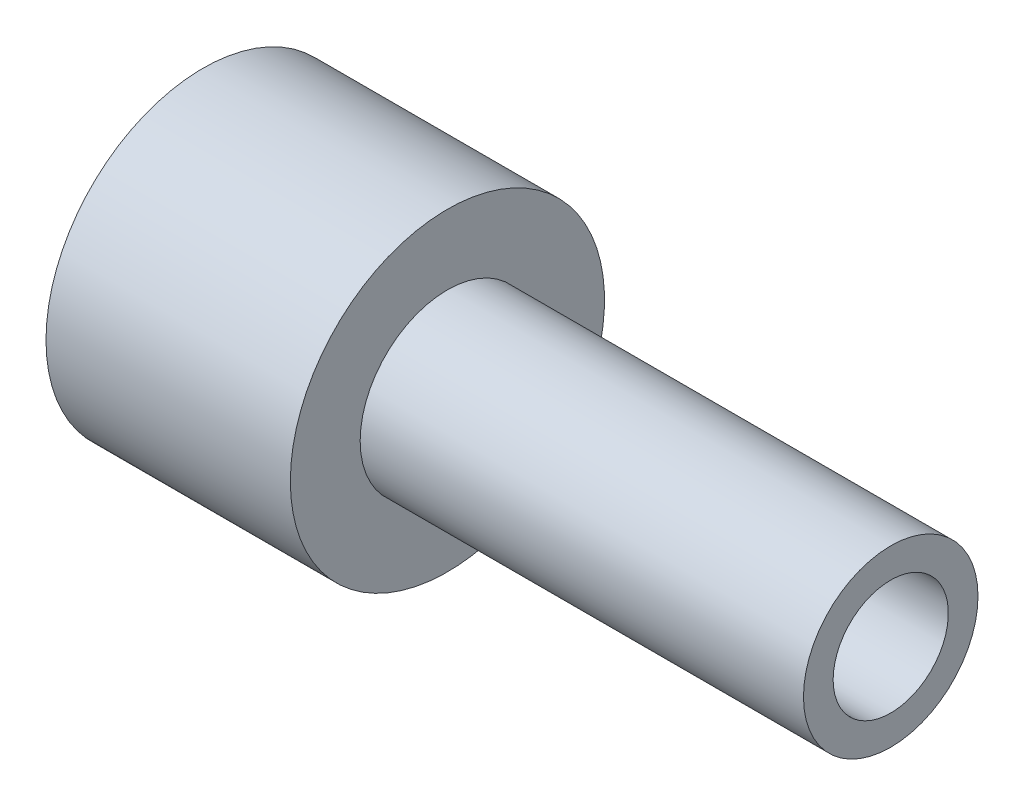
ISO-10303-21;
HEADER;
FILE_DESCRIPTION(('STEP AP214'),'2;1');
FILE_NAME('part.step','',(''),(''),'','','');
FILE_SCHEMA(('AUTOMOTIVE_DESIGN { 1 0 10303 214 1 1 1 1 }'));
ENDSEC;
DATA;
#1=APPLICATION_CONTEXT('core data for automotive mechanical design processes');
#2=APPLICATION_PROTOCOL_DEFINITION('international standard','automotive_design',2000,#1);
#3=PRODUCT_CONTEXT('',#1,'mechanical');
#4=PRODUCT('Part','Part','',(#3));
#5=PRODUCT_RELATED_PRODUCT_CATEGORY('part','',(#4));
#6=PRODUCT_DEFINITION_FORMATION('','',#4);
#7=PRODUCT_DEFINITION_CONTEXT('part definition',#1,'design');
#8=PRODUCT_DEFINITION('design','',#6,#7);
#9=PRODUCT_DEFINITION_SHAPE('','',#8);
#10=(LENGTH_UNIT() NAMED_UNIT(*) SI_UNIT(.MILLI.,.METRE.));
#11=(NAMED_UNIT(*) PLANE_ANGLE_UNIT() SI_UNIT($,.RADIAN.));
#12=(NAMED_UNIT(*) SI_UNIT($,.STERADIAN.) SOLID_ANGLE_UNIT());
#13=UNCERTAINTY_MEASURE_WITH_UNIT(LENGTH_MEASURE(1.E-05),#10,'distance_accuracy_value','');
#14=(GEOMETRIC_REPRESENTATION_CONTEXT(3) GLOBAL_UNCERTAINTY_ASSIGNED_CONTEXT((#13)) GLOBAL_UNIT_ASSIGNED_CONTEXT((#10,
#11,#12)) REPRESENTATION_CONTEXT('',''));
#15=CARTESIAN_POINT('',(0.,0.,0.));
#16=DIRECTION('',(0.,0.,1.));
#17=DIRECTION('',(1.,0.,0.));
#18=AXIS2_PLACEMENT_3D('',#15,#16,#17);
#19=CARTESIAN_POINT('',(-6.,4.5,0.));
#20=DIRECTION('',(1.,0.,0.));
#21=DIRECTION('',(0.,0.,-1.));
#22=AXIS2_PLACEMENT_3D('',#19,#20,#21);
#23=PLANE('',#22);
#24=CARTESIAN_POINT('',(-6.00000000000001,0.,0.));
#25=DIRECTION('',(-1.,0.,0.));
#26=DIRECTION('',(0.,0.,1.));
#27=AXIS2_PLACEMENT_3D('',#24,#25,#26);
#28=CIRCLE('',#27,1.65);
#29=CARTESIAN_POINT('',(-6.00000000000001,0.,1.65));
#30=VERTEX_POINT('',#29);
#31=EDGE_CURVE('E10',#30,#30,#28,.T.);
#32=ORIENTED_EDGE('',*,*,#31,.F.);
#33=EDGE_LOOP('',(#32));
#34=FACE_BOUND('',#33,.T.);
#35=CARTESIAN_POINT('',(-6.00000000000001,0.,0.));
#36=DIRECTION('',(-1.,0.,0.));
#37=DIRECTION('',(0.,0.,1.));
#38=AXIS2_PLACEMENT_3D('',#35,#36,#37);
#39=CIRCLE('',#38,4.5);
#40=CARTESIAN_POINT('',(-6.00000000000001,0.,4.5));
#41=VERTEX_POINT('',#40);
#42=EDGE_CURVE('E53',#41,#41,#39,.T.);
#43=ORIENTED_EDGE('',*,*,#42,.T.);
#44=EDGE_LOOP('',(#43));
#45=FACE_BOUND('',#44,.T.);
#46=ADVANCED_FACE('F31',(#34,#45),#23,.F.);
#47=CARTESIAN_POINT('',(-110.,0.,0.));
#48=DIRECTION('',(-1.,0.,0.));
#49=DIRECTION('',(0.,0.,1.));
#50=AXIS2_PLACEMENT_3D('',#47,#48,#49);
#51=CYLINDRICAL_SURFACE('',#50,1.65);
#52=CARTESIAN_POINT('',(13.7,0.,0.));
#53=DIRECTION('',(-1.,0.,0.));
#54=DIRECTION('',(0.,0.,1.));
#55=AXIS2_PLACEMENT_3D('',#52,#53,#54);
#56=CIRCLE('',#55,1.65);
#57=CARTESIAN_POINT('',(13.7,0.,1.65));
#58=VERTEX_POINT('',#57);
#59=EDGE_CURVE('E37',#58,#58,#56,.T.);
#60=ORIENTED_EDGE('',*,*,#59,.F.);
#61=EDGE_LOOP('',(#60));
#62=FACE_BOUND('',#61,.T.);
#63=ORIENTED_EDGE('',*,*,#31,.T.);
#64=EDGE_LOOP('',(#63));
#65=FACE_BOUND('',#64,.T.);
#66=ADVANCED_FACE('F78',(#62,#65),#51,.F.);
#67=CARTESIAN_POINT('',(13.7,1.65,0.));
#68=DIRECTION('',(-1.,0.,0.));
#69=DIRECTION('',(0.,0.,1.));
#70=AXIS2_PLACEMENT_3D('',#67,#68,#69);
#71=PLANE('',#70);
#72=CARTESIAN_POINT('',(13.7,0.,0.));
#73=DIRECTION('',(-1.,0.,0.));
#74=DIRECTION('',(0.,0.,1.));
#75=AXIS2_PLACEMENT_3D('',#72,#73,#74);
#76=CIRCLE('',#75,2.5);
#77=CARTESIAN_POINT('',(13.7,0.,2.5));
#78=VERTEX_POINT('',#77);
#79=EDGE_CURVE('E41',#78,#78,#76,.T.);
#80=ORIENTED_EDGE('',*,*,#79,.F.);
#81=EDGE_LOOP('',(#80));
#82=FACE_BOUND('',#81,.T.);
#83=ORIENTED_EDGE('',*,*,#59,.T.);
#84=EDGE_LOOP('',(#83));
#85=FACE_BOUND('',#84,.T.);
#86=ADVANCED_FACE('F73',(#82,#85),#71,.F.);
#87=CARTESIAN_POINT('',(-110.,0.,0.));
#88=DIRECTION('',(-1.,0.,0.));
#89=DIRECTION('',(0.,0.,1.));
#90=AXIS2_PLACEMENT_3D('',#87,#88,#89);
#91=CYLINDRICAL_SURFACE('',#90,2.5);
#92=CARTESIAN_POINT('',(1.,0.,0.));
#93=DIRECTION('',(-1.,0.,0.));
#94=DIRECTION('',(0.,0.,1.));
#95=AXIS2_PLACEMENT_3D('',#92,#93,#94);
#96=CIRCLE('',#95,2.5);
#97=CARTESIAN_POINT('',(1.,0.,2.5));
#98=VERTEX_POINT('',#97);
#99=EDGE_CURVE('E45',#98,#98,#96,.T.);
#100=ORIENTED_EDGE('',*,*,#99,.F.);
#101=EDGE_LOOP('',(#100));
#102=FACE_BOUND('',#101,.T.);
#103=ORIENTED_EDGE('',*,*,#79,.T.);
#104=EDGE_LOOP('',(#103));
#105=FACE_BOUND('',#104,.T.);
#106=ADVANCED_FACE('F67',(#102,#105),#91,.T.);
#107=CARTESIAN_POINT('',(1.,2.5,0.));
#108=DIRECTION('',(-1.,0.,0.));
#109=DIRECTION('',(0.,0.,1.));
#110=AXIS2_PLACEMENT_3D('',#107,#108,#109);
#111=PLANE('',#110);
#112=CARTESIAN_POINT('',(1.,0.,0.));
#113=DIRECTION('',(-1.,0.,0.));
#114=DIRECTION('',(0.,0.,1.));
#115=AXIS2_PLACEMENT_3D('',#112,#113,#114);
#116=CIRCLE('',#115,4.5);
#117=CARTESIAN_POINT('',(1.,0.,4.5));
#118=VERTEX_POINT('',#117);
#119=EDGE_CURVE('E50',#118,#118,#116,.T.);
#120=ORIENTED_EDGE('',*,*,#119,.F.);
#121=EDGE_LOOP('',(#120));
#122=FACE_BOUND('',#121,.T.);
#123=ORIENTED_EDGE('',*,*,#99,.T.);
#124=EDGE_LOOP('',(#123));
#125=FACE_BOUND('',#124,.T.);
#126=ADVANCED_FACE('F61',(#122,#125),#111,.F.);
#127=CARTESIAN_POINT('',(-110.,0.,0.));
#128=DIRECTION('',(-1.,0.,0.));
#129=DIRECTION('',(0.,0.,1.));
#130=AXIS2_PLACEMENT_3D('',#127,#128,#129);
#131=CYLINDRICAL_SURFACE('',#130,4.5);
#132=ORIENTED_EDGE('',*,*,#42,.F.);
#133=EDGE_LOOP('',(#132));
#134=FACE_BOUND('',#133,.T.);
#135=ORIENTED_EDGE('',*,*,#119,.T.);
#136=EDGE_LOOP('',(#135));
#137=FACE_BOUND('',#136,.T.);
#138=ADVANCED_FACE('F58',(#134,#137),#131,.T.);
#139=CLOSED_SHELL('',(#46,#66,#86,#106,#126,#138));
#140=MANIFOLD_SOLID_BREP('B2',#139);
#141=ADVANCED_BREP_SHAPE_REPRESENTATION('',(#18,#140),#14);
#142=SHAPE_DEFINITION_REPRESENTATION(#9,#141);
ENDSEC;
END-ISO-10303-21;
